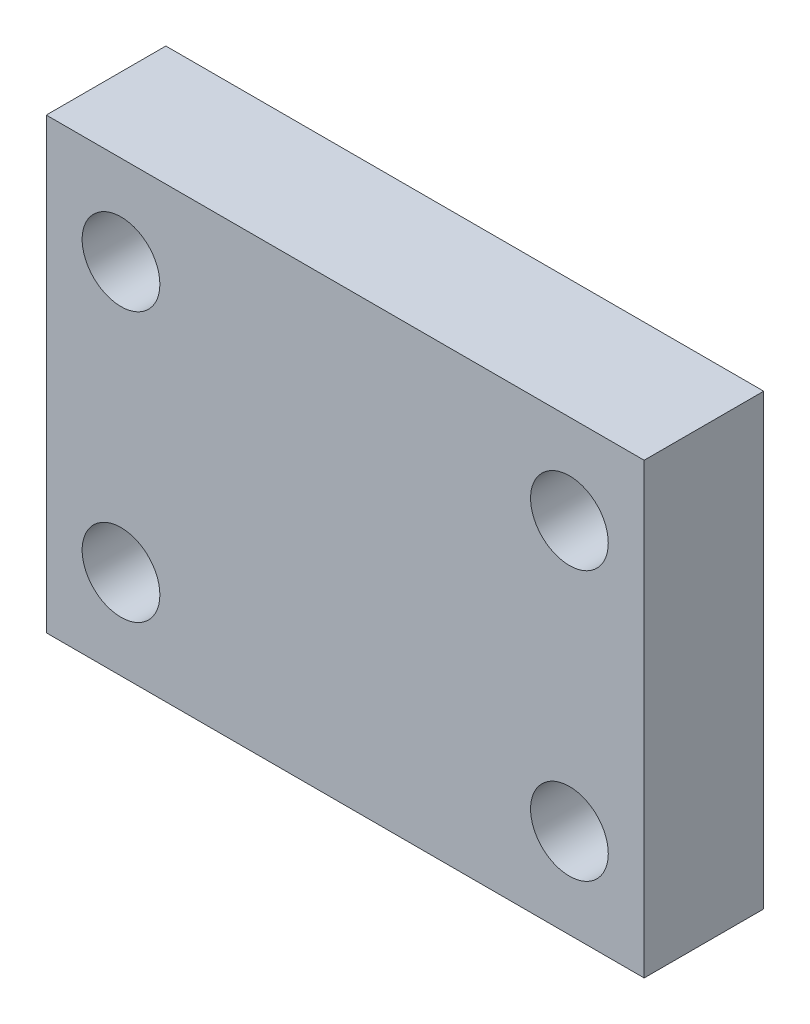
ISO-10303-21;
HEADER;
FILE_DESCRIPTION(('STEP AP214'),'2;1');
FILE_NAME('part.step','',(''),(''),'','','');
FILE_SCHEMA(('AUTOMOTIVE_DESIGN { 1 0 10303 214 1 1 1 1 }'));
ENDSEC;
DATA;
#1=APPLICATION_CONTEXT('core data for automotive mechanical design processes');
#2=APPLICATION_PROTOCOL_DEFINITION('international standard','automotive_design',2000,#1);
#3=PRODUCT_CONTEXT('',#1,'mechanical');
#4=PRODUCT('Part','Part','',(#3));
#5=PRODUCT_RELATED_PRODUCT_CATEGORY('part','',(#4));
#6=PRODUCT_DEFINITION_FORMATION('','',#4);
#7=PRODUCT_DEFINITION_CONTEXT('part definition',#1,'design');
#8=PRODUCT_DEFINITION('design','',#6,#7);
#9=PRODUCT_DEFINITION_SHAPE('','',#8);
#10=(LENGTH_UNIT() NAMED_UNIT(*) SI_UNIT(.MILLI.,.METRE.));
#11=(NAMED_UNIT(*) PLANE_ANGLE_UNIT() SI_UNIT($,.RADIAN.));
#12=(NAMED_UNIT(*) SI_UNIT($,.STERADIAN.) SOLID_ANGLE_UNIT());
#13=UNCERTAINTY_MEASURE_WITH_UNIT(LENGTH_MEASURE(1.E-05),#10,'distance_accuracy_value','');
#14=(GEOMETRIC_REPRESENTATION_CONTEXT(3) GLOBAL_UNCERTAINTY_ASSIGNED_CONTEXT((#13)) GLOBAL_UNIT_ASSIGNED_CONTEXT((#10,
#11,#12)) REPRESENTATION_CONTEXT('',''));
#15=CARTESIAN_POINT('',(0.,0.,0.));
#16=DIRECTION('',(0.,0.,1.));
#17=DIRECTION('',(1.,0.,0.));
#18=AXIS2_PLACEMENT_3D('',#15,#16,#17);
#19=CARTESIAN_POINT('',(0.,0.,8.));
#20=DIRECTION('',(0.,0.,1.));
#21=DIRECTION('',(1.,0.,0.));
#22=AXIS2_PLACEMENT_3D('',#19,#20,#21);
#23=PLANE('',#22);
#24=CARTESIAN_POINT('',(-15.,9.,8.));
#25=DIRECTION('',(0.,0.,1.));
#26=DIRECTION('',(1.,0.,0.));
#27=AXIS2_PLACEMENT_3D('',#24,#25,#26);
#28=CIRCLE('',#27,2.6);
#29=CARTESIAN_POINT('',(-12.4,9.,8.));
#30=VERTEX_POINT('',#29);
#31=EDGE_CURVE('E153',#30,#30,#28,.T.);
#32=ORIENTED_EDGE('',*,*,#31,.F.);
#33=EDGE_LOOP('',(#32));
#34=FACE_BOUND('',#33,.T.);
#35=CARTESIAN_POINT('',(-15.,-9.,8.));
#36=DIRECTION('',(0.,0.,1.));
#37=DIRECTION('',(1.,0.,0.));
#38=AXIS2_PLACEMENT_3D('',#35,#36,#37);
#39=CIRCLE('',#38,2.6);
#40=CARTESIAN_POINT('',(-12.4,-9.,8.));
#41=VERTEX_POINT('',#40);
#42=EDGE_CURVE('E121',#41,#41,#39,.T.);
#43=ORIENTED_EDGE('',*,*,#42,.F.);
#44=EDGE_LOOP('',(#43));
#45=FACE_BOUND('',#44,.T.);
#46=DIRECTION('',(0.,-1.,0.));
#47=VECTOR('',#46,1.);
#48=CARTESIAN_POINT('',(-20.,-15.,8.));
#49=LINE('',#48,#47);
#50=CARTESIAN_POINT('',(-20.,15.,8.));
#51=VERTEX_POINT('',#50);
#52=CARTESIAN_POINT('',(-20.,-15.,8.));
#53=VERTEX_POINT('',#52);
#54=EDGE_CURVE('E100',#51,#53,#49,.T.);
#55=ORIENTED_EDGE('',*,*,#54,.T.);
#56=DIRECTION('',(1.,0.,0.));
#57=VECTOR('',#56,1.);
#58=CARTESIAN_POINT('',(20.,-15.,8.));
#59=LINE('',#58,#57);
#60=CARTESIAN_POINT('',(20.,-15.,8.));
#61=VERTEX_POINT('',#60);
#62=EDGE_CURVE('E95',#53,#61,#59,.T.);
#63=ORIENTED_EDGE('',*,*,#62,.T.);
#64=DIRECTION('',(0.,1.,0.));
#65=VECTOR('',#64,1.);
#66=CARTESIAN_POINT('',(20.,-15.,8.));
#67=LINE('',#66,#65);
#68=CARTESIAN_POINT('',(20.,15.,8.));
#69=VERTEX_POINT('',#68);
#70=EDGE_CURVE('E98',#61,#69,#67,.T.);
#71=ORIENTED_EDGE('',*,*,#70,.T.);
#72=DIRECTION('',(-1.,0.,0.));
#73=VECTOR('',#72,1.);
#74=CARTESIAN_POINT('',(20.,15.,8.));
#75=LINE('',#74,#73);
#76=EDGE_CURVE('E65',#69,#51,#75,.T.);
#77=ORIENTED_EDGE('',*,*,#76,.T.);
#78=EDGE_LOOP('',(#55,#63,#71,#77));
#79=FACE_BOUND('',#78,.T.);
#80=CARTESIAN_POINT('',(15.,-9.,8.));
#81=DIRECTION('',(0.,0.,1.));
#82=DIRECTION('',(1.,0.,0.));
#83=AXIS2_PLACEMENT_3D('',#80,#81,#82);
#84=CIRCLE('',#83,2.6);
#85=CARTESIAN_POINT('',(17.6,-9.,8.));
#86=VERTEX_POINT('',#85);
#87=EDGE_CURVE('E145',#86,#86,#84,.T.);
#88=ORIENTED_EDGE('',*,*,#87,.F.);
#89=EDGE_LOOP('',(#88));
#90=FACE_BOUND('',#89,.T.);
#91=CARTESIAN_POINT('',(15.,9.,8.));
#92=DIRECTION('',(0.,0.,1.));
#93=DIRECTION('',(1.,0.,0.));
#94=AXIS2_PLACEMENT_3D('',#91,#92,#93);
#95=CIRCLE('',#94,2.6);
#96=CARTESIAN_POINT('',(17.6,9.,8.));
#97=VERTEX_POINT('',#96);
#98=EDGE_CURVE('E161',#97,#97,#95,.T.);
#99=ORIENTED_EDGE('',*,*,#98,.F.);
#100=EDGE_LOOP('',(#99));
#101=FACE_BOUND('',#100,.T.);
#102=ADVANCED_FACE('F47',(#34,#45,#79,#90,#101),#23,.T.);
#103=CARTESIAN_POINT('',(0.,0.,0.));
#104=DIRECTION('',(0.,0.,1.));
#105=DIRECTION('',(1.,0.,0.));
#106=AXIS2_PLACEMENT_3D('',#103,#104,#105);
#107=PLANE('',#106);
#108=DIRECTION('',(0.,-1.,0.));
#109=VECTOR('',#108,1.);
#110=CARTESIAN_POINT('',(-20.,-15.,0.));
#111=LINE('',#110,#109);
#112=CARTESIAN_POINT('',(-20.,15.,0.));
#113=VERTEX_POINT('',#112);
#114=CARTESIAN_POINT('',(-20.,-15.,0.));
#115=VERTEX_POINT('',#114);
#116=EDGE_CURVE('E117',#113,#115,#111,.T.);
#117=ORIENTED_EDGE('',*,*,#116,.F.);
#118=DIRECTION('',(-1.,0.,0.));
#119=VECTOR('',#118,1.);
#120=CARTESIAN_POINT('',(20.,15.,0.));
#121=LINE('',#120,#119);
#122=CARTESIAN_POINT('',(20.,15.,0.));
#123=VERTEX_POINT('',#122);
#124=EDGE_CURVE('E88',#123,#113,#121,.T.);
#125=ORIENTED_EDGE('',*,*,#124,.F.);
#126=DIRECTION('',(0.,1.,0.));
#127=VECTOR('',#126,1.);
#128=CARTESIAN_POINT('',(20.,-15.,0.));
#129=LINE('',#128,#127);
#130=CARTESIAN_POINT('',(20.,-15.,0.));
#131=VERTEX_POINT('',#130);
#132=EDGE_CURVE('E82',#131,#123,#129,.T.);
#133=ORIENTED_EDGE('',*,*,#132,.F.);
#134=DIRECTION('',(1.,0.,0.));
#135=VECTOR('',#134,1.);
#136=CARTESIAN_POINT('',(20.,-15.,0.));
#137=LINE('',#136,#135);
#138=EDGE_CURVE('E105',#115,#131,#137,.T.);
#139=ORIENTED_EDGE('',*,*,#138,.F.);
#140=EDGE_LOOP('',(#117,#125,#133,#139));
#141=FACE_BOUND('',#140,.T.);
#142=CARTESIAN_POINT('',(-15.,-9.,0.));
#143=DIRECTION('',(0.,0.,1.));
#144=DIRECTION('',(1.,0.,0.));
#145=AXIS2_PLACEMENT_3D('',#142,#143,#144);
#146=CIRCLE('',#145,2.6);
#147=CARTESIAN_POINT('',(-12.4,-9.,0.));
#148=VERTEX_POINT('',#147);
#149=EDGE_CURVE('E141',#148,#148,#146,.T.);
#150=ORIENTED_EDGE('',*,*,#149,.T.);
#151=EDGE_LOOP('',(#150));
#152=FACE_BOUND('',#151,.T.);
#153=CARTESIAN_POINT('',(15.,-9.,0.));
#154=DIRECTION('',(0.,0.,1.));
#155=DIRECTION('',(1.,0.,0.));
#156=AXIS2_PLACEMENT_3D('',#153,#154,#155);
#157=CIRCLE('',#156,2.6);
#158=CARTESIAN_POINT('',(17.6,-9.,0.));
#159=VERTEX_POINT('',#158);
#160=EDGE_CURVE('E149',#159,#159,#157,.T.);
#161=ORIENTED_EDGE('',*,*,#160,.T.);
#162=EDGE_LOOP('',(#161));
#163=FACE_BOUND('',#162,.T.);
#164=CARTESIAN_POINT('',(-15.,9.,0.));
#165=DIRECTION('',(0.,0.,1.));
#166=DIRECTION('',(1.,0.,0.));
#167=AXIS2_PLACEMENT_3D('',#164,#165,#166);
#168=CIRCLE('',#167,2.6);
#169=CARTESIAN_POINT('',(-12.4,9.,0.));
#170=VERTEX_POINT('',#169);
#171=EDGE_CURVE('E157',#170,#170,#168,.T.);
#172=ORIENTED_EDGE('',*,*,#171,.T.);
#173=EDGE_LOOP('',(#172));
#174=FACE_BOUND('',#173,.T.);
#175=CARTESIAN_POINT('',(15.,9.,0.));
#176=DIRECTION('',(0.,0.,1.));
#177=DIRECTION('',(1.,0.,0.));
#178=AXIS2_PLACEMENT_3D('',#175,#176,#177);
#179=CIRCLE('',#178,2.6);
#180=CARTESIAN_POINT('',(17.6,9.,0.));
#181=VERTEX_POINT('',#180);
#182=EDGE_CURVE('E165',#181,#181,#179,.T.);
#183=ORIENTED_EDGE('',*,*,#182,.T.);
#184=EDGE_LOOP('',(#183));
#185=FACE_BOUND('',#184,.T.);
#186=ADVANCED_FACE('F135',(#141,#152,#163,#174,#185),#107,.F.);
#187=CARTESIAN_POINT('',(-20.,-15.,8.));
#188=DIRECTION('',(1.,0.,0.));
#189=DIRECTION('',(0.,0.,-1.));
#190=AXIS2_PLACEMENT_3D('',#187,#188,#189);
#191=PLANE('',#190);
#192=ORIENTED_EDGE('',*,*,#116,.T.);
#193=DIRECTION('',(0.,0.,-1.));
#194=VECTOR('',#193,1.);
#195=CARTESIAN_POINT('',(-20.,-15.,8.));
#196=LINE('',#195,#194);
#197=EDGE_CURVE('E11',#53,#115,#196,.T.);
#198=ORIENTED_EDGE('',*,*,#197,.F.);
#199=ORIENTED_EDGE('',*,*,#54,.F.);
#200=DIRECTION('',(0.,0.,-1.));
#201=VECTOR('',#200,1.);
#202=CARTESIAN_POINT('',(-20.,15.,8.));
#203=LINE('',#202,#201);
#204=EDGE_CURVE('E113',#51,#113,#203,.T.);
#205=ORIENTED_EDGE('',*,*,#204,.T.);
#206=EDGE_LOOP('',(#192,#198,#199,#205));
#207=FACE_BOUND('',#206,.T.);
#208=ADVANCED_FACE('F49',(#207),#191,.F.);
#209=CARTESIAN_POINT('',(20.,-15.,8.));
#210=DIRECTION('',(0.,1.,0.));
#211=DIRECTION('',(-1.,0.,0.));
#212=AXIS2_PLACEMENT_3D('',#209,#210,#211);
#213=PLANE('',#212);
#214=ORIENTED_EDGE('',*,*,#138,.T.);
#215=DIRECTION('',(0.,0.,-1.));
#216=VECTOR('',#215,1.);
#217=CARTESIAN_POINT('',(20.,-15.,8.));
#218=LINE('',#217,#216);
#219=EDGE_CURVE('E57',#61,#131,#218,.T.);
#220=ORIENTED_EDGE('',*,*,#219,.F.);
#221=ORIENTED_EDGE('',*,*,#62,.F.);
#222=ORIENTED_EDGE('',*,*,#197,.T.);
#223=EDGE_LOOP('',(#214,#220,#221,#222));
#224=FACE_BOUND('',#223,.T.);
#225=ADVANCED_FACE('F104',(#224),#213,.F.);
#226=CARTESIAN_POINT('',(20.,-15.,8.));
#227=DIRECTION('',(-1.,0.,0.));
#228=DIRECTION('',(0.,0.,1.));
#229=AXIS2_PLACEMENT_3D('',#226,#227,#228);
#230=PLANE('',#229);
#231=ORIENTED_EDGE('',*,*,#132,.T.);
#232=DIRECTION('',(0.,0.,-1.));
#233=VECTOR('',#232,1.);
#234=CARTESIAN_POINT('',(20.,15.,8.));
#235=LINE('',#234,#233);
#236=EDGE_CURVE('E107',#69,#123,#235,.T.);
#237=ORIENTED_EDGE('',*,*,#236,.F.);
#238=ORIENTED_EDGE('',*,*,#70,.F.);
#239=ORIENTED_EDGE('',*,*,#219,.T.);
#240=EDGE_LOOP('',(#231,#237,#238,#239));
#241=FACE_BOUND('',#240,.T.);
#242=ADVANCED_FACE('F108',(#241),#230,.F.);
#243=CARTESIAN_POINT('',(20.,15.,8.));
#244=DIRECTION('',(0.,-1.,0.));
#245=DIRECTION('',(1.,0.,0.));
#246=AXIS2_PLACEMENT_3D('',#243,#244,#245);
#247=PLANE('',#246);
#248=ORIENTED_EDGE('',*,*,#124,.T.);
#249=ORIENTED_EDGE('',*,*,#204,.F.);
#250=ORIENTED_EDGE('',*,*,#76,.F.);
#251=ORIENTED_EDGE('',*,*,#236,.T.);
#252=EDGE_LOOP('',(#248,#249,#250,#251));
#253=FACE_BOUND('',#252,.T.);
#254=ADVANCED_FACE('F132',(#253),#247,.F.);
#255=CARTESIAN_POINT('',(-15.,-9.,8.));
#256=DIRECTION('',(0.,0.,-1.));
#257=DIRECTION('',(-1.,0.,0.));
#258=AXIS2_PLACEMENT_3D('',#255,#256,#257);
#259=CYLINDRICAL_SURFACE('',#258,2.6);
#260=ORIENTED_EDGE('',*,*,#42,.T.);
#261=EDGE_LOOP('',(#260));
#262=FACE_BOUND('',#261,.T.);
#263=ORIENTED_EDGE('',*,*,#149,.F.);
#264=EDGE_LOOP('',(#263));
#265=FACE_BOUND('',#264,.T.);
#266=ADVANCED_FACE('F187',(#262,#265),#259,.F.);
#267=CARTESIAN_POINT('',(15.,-9.,8.));
#268=DIRECTION('',(0.,0.,-1.));
#269=DIRECTION('',(-1.,0.,0.));
#270=AXIS2_PLACEMENT_3D('',#267,#268,#269);
#271=CYLINDRICAL_SURFACE('',#270,2.6);
#272=ORIENTED_EDGE('',*,*,#87,.T.);
#273=EDGE_LOOP('',(#272));
#274=FACE_BOUND('',#273,.T.);
#275=ORIENTED_EDGE('',*,*,#160,.F.);
#276=EDGE_LOOP('',(#275));
#277=FACE_BOUND('',#276,.T.);
#278=ADVANCED_FACE('F252',(#274,#277),#271,.F.);
#279=CARTESIAN_POINT('',(-15.,9.,8.));
#280=DIRECTION('',(0.,0.,-1.));
#281=DIRECTION('',(-1.,0.,0.));
#282=AXIS2_PLACEMENT_3D('',#279,#280,#281);
#283=CYLINDRICAL_SURFACE('',#282,2.6);
#284=ORIENTED_EDGE('',*,*,#31,.T.);
#285=EDGE_LOOP('',(#284));
#286=FACE_BOUND('',#285,.T.);
#287=ORIENTED_EDGE('',*,*,#171,.F.);
#288=EDGE_LOOP('',(#287));
#289=FACE_BOUND('',#288,.T.);
#290=ADVANCED_FACE('F263',(#286,#289),#283,.F.);
#291=CARTESIAN_POINT('',(15.,9.,8.));
#292=DIRECTION('',(0.,0.,-1.));
#293=DIRECTION('',(-1.,0.,0.));
#294=AXIS2_PLACEMENT_3D('',#291,#292,#293);
#295=CYLINDRICAL_SURFACE('',#294,2.6);
#296=ORIENTED_EDGE('',*,*,#98,.T.);
#297=EDGE_LOOP('',(#296));
#298=FACE_BOUND('',#297,.T.);
#299=ORIENTED_EDGE('',*,*,#182,.F.);
#300=EDGE_LOOP('',(#299));
#301=FACE_BOUND('',#300,.T.);
#302=ADVANCED_FACE('F174',(#298,#301),#295,.F.);
#303=CLOSED_SHELL('',(#102,#186,#208,#225,#242,#254,#266,#278,#290,#302));
#304=MANIFOLD_SOLID_BREP('B2',#303);
#305=ADVANCED_BREP_SHAPE_REPRESENTATION('',(#18,#304),#14);
#306=SHAPE_DEFINITION_REPRESENTATION(#9,#305);
ENDSEC;
END-ISO-10303-21;
